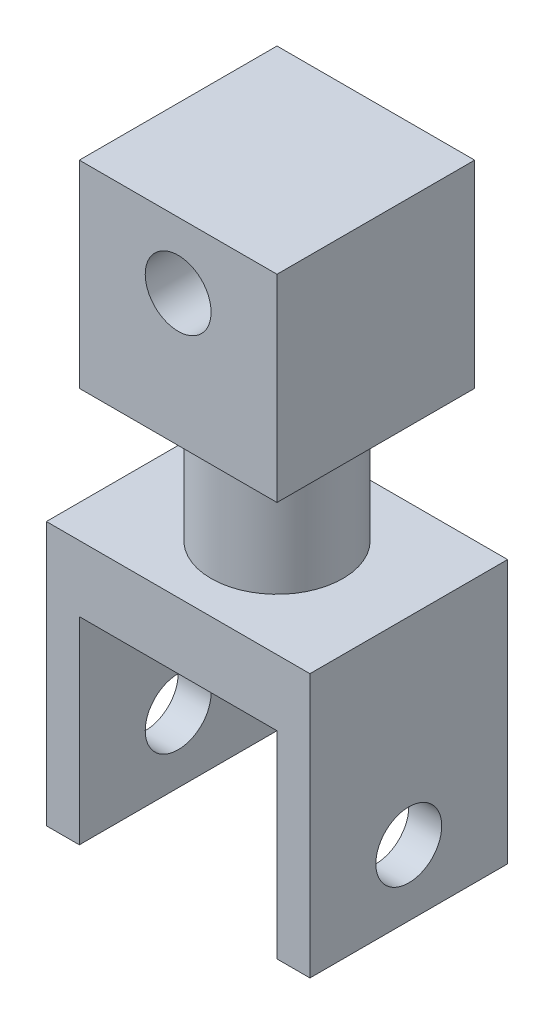
ISO-10303-21;
HEADER;
FILE_DESCRIPTION(('STEP AP214'),'2;1');
FILE_NAME('part.step','',(''),(''),'','','');
FILE_SCHEMA(('AUTOMOTIVE_DESIGN { 1 0 10303 214 1 1 1 1 }'));
ENDSEC;
DATA;
#1=APPLICATION_CONTEXT('core data for automotive mechanical design processes');
#2=APPLICATION_PROTOCOL_DEFINITION('international standard','automotive_design',2000,#1);
#3=PRODUCT_CONTEXT('',#1,'mechanical');
#4=PRODUCT('Part','Part','',(#3));
#5=PRODUCT_RELATED_PRODUCT_CATEGORY('part','',(#4));
#6=PRODUCT_DEFINITION_FORMATION('','',#4);
#7=PRODUCT_DEFINITION_CONTEXT('part definition',#1,'design');
#8=PRODUCT_DEFINITION('design','',#6,#7);
#9=PRODUCT_DEFINITION_SHAPE('','',#8);
#10=(LENGTH_UNIT() NAMED_UNIT(*) SI_UNIT(.MILLI.,.METRE.));
#11=(NAMED_UNIT(*) PLANE_ANGLE_UNIT() SI_UNIT($,.RADIAN.));
#12=(NAMED_UNIT(*) SI_UNIT($,.STERADIAN.) SOLID_ANGLE_UNIT());
#13=UNCERTAINTY_MEASURE_WITH_UNIT(LENGTH_MEASURE(1.E-05),#10,'distance_accuracy_value','');
#14=(GEOMETRIC_REPRESENTATION_CONTEXT(3) GLOBAL_UNCERTAINTY_ASSIGNED_CONTEXT((#13)) GLOBAL_UNIT_ASSIGNED_CONTEXT((#10,
#11,#12)) REPRESENTATION_CONTEXT('',''));
#15=CARTESIAN_POINT('',(0.,0.,0.));
#16=DIRECTION('',(0.,0.,1.));
#17=DIRECTION('',(1.,0.,0.));
#18=AXIS2_PLACEMENT_3D('',#15,#16,#17);
#19=CARTESIAN_POINT('',(0.,0.,0.));
#20=DIRECTION('',(0.,1.,0.));
#21=DIRECTION('',(0.,0.,1.));
#22=AXIS2_PLACEMENT_3D('',#19,#20,#21);
#23=PLANE('',#22);
#24=DIRECTION('',(1.,0.,0.));
#25=VECTOR('',#24,1.);
#26=CARTESIAN_POINT('',(0.,0.,-76.2));
#27=LINE('',#26,#25);
#28=CARTESIAN_POINT('',(0.,0.,-76.2));
#29=VERTEX_POINT('',#28);
#30=CARTESIAN_POINT('',(12.7,0.,-76.2));
#31=VERTEX_POINT('',#30);
#32=EDGE_CURVE('E209',#29,#31,#27,.T.);
#33=ORIENTED_EDGE('',*,*,#32,.T.);
#34=DIRECTION('',(0.,0.,-1.));
#35=VECTOR('',#34,1.);
#36=CARTESIAN_POINT('',(12.7,0.,0.));
#37=LINE('',#36,#35);
#38=CARTESIAN_POINT('',(12.7,0.,0.));
#39=VERTEX_POINT('',#38);
#40=EDGE_CURVE('E163',#39,#31,#37,.T.);
#41=ORIENTED_EDGE('',*,*,#40,.F.);
#42=DIRECTION('',(1.,0.,0.));
#43=VECTOR('',#42,1.);
#44=CARTESIAN_POINT('',(0.,0.,0.));
#45=LINE('',#44,#43);
#46=CARTESIAN_POINT('',(0.,0.,0.));
#47=VERTEX_POINT('',#46);
#48=EDGE_CURVE('E203',#47,#39,#45,.T.);
#49=ORIENTED_EDGE('',*,*,#48,.F.);
#50=DIRECTION('',(0.,0.,-1.));
#51=VECTOR('',#50,1.);
#52=CARTESIAN_POINT('',(0.,0.,0.));
#53=LINE('',#52,#51);
#54=EDGE_CURVE('E196',#47,#29,#53,.T.);
#55=ORIENTED_EDGE('',*,*,#54,.T.);
#56=EDGE_LOOP('',(#33,#41,#49,#55));
#57=FACE_BOUND('',#56,.T.);
#58=ADVANCED_FACE('F35',(#57),#23,.F.);
#59=CARTESIAN_POINT('',(0.,101.6,0.));
#60=DIRECTION('',(0.,0.,-1.));
#61=DIRECTION('',(-1.,0.,0.));
#62=AXIS2_PLACEMENT_3D('',#59,#60,#61);
#63=PLANE('',#62);
#64=ORIENTED_EDGE('',*,*,#48,.T.);
#65=DIRECTION('',(0.,-1.,0.));
#66=VECTOR('',#65,1.);
#67=CARTESIAN_POINT('',(12.7,76.2,0.));
#68=LINE('',#67,#66);
#69=CARTESIAN_POINT('',(12.7,76.2,0.));
#70=VERTEX_POINT('',#69);
#71=EDGE_CURVE('E185',#70,#39,#68,.T.);
#72=ORIENTED_EDGE('',*,*,#71,.F.);
#73=DIRECTION('',(-1.,0.,0.));
#74=VECTOR('',#73,1.);
#75=CARTESIAN_POINT('',(88.9,76.2,0.));
#76=LINE('',#75,#74);
#77=CARTESIAN_POINT('',(88.9,76.2,0.));
#78=VERTEX_POINT('',#77);
#79=EDGE_CURVE('E179',#78,#70,#76,.T.);
#80=ORIENTED_EDGE('',*,*,#79,.F.);
#81=DIRECTION('',(0.,-1.,0.));
#82=VECTOR('',#81,1.);
#83=CARTESIAN_POINT('',(88.9,76.2,0.));
#84=LINE('',#83,#82);
#85=CARTESIAN_POINT('',(88.9,0.,0.));
#86=VERTEX_POINT('',#85);
#87=EDGE_CURVE('E188',#78,#86,#84,.T.);
#88=ORIENTED_EDGE('',*,*,#87,.T.);
#89=CARTESIAN_POINT('',(101.6,0.,0.));
#90=VERTEX_POINT('',#89);
#91=EDGE_CURVE('E187',#86,#90,#45,.T.);
#92=ORIENTED_EDGE('',*,*,#91,.T.);
#93=DIRECTION('',(0.,-1.,0.));
#94=VECTOR('',#93,1.);
#95=CARTESIAN_POINT('',(101.6,101.6,0.));
#96=LINE('',#95,#94);
#97=CARTESIAN_POINT('',(101.6,101.6,0.));
#98=VERTEX_POINT('',#97);
#99=EDGE_CURVE('E44',#98,#90,#96,.T.);
#100=ORIENTED_EDGE('',*,*,#99,.F.);
#101=DIRECTION('',(1.,0.,0.));
#102=VECTOR('',#101,1.);
#103=CARTESIAN_POINT('',(0.,101.6,0.));
#104=LINE('',#103,#102);
#105=CARTESIAN_POINT('',(0.,101.6,0.));
#106=VERTEX_POINT('',#105);
#107=EDGE_CURVE('E194',#106,#98,#104,.T.);
#108=ORIENTED_EDGE('',*,*,#107,.F.);
#109=DIRECTION('',(0.,-1.,0.));
#110=VECTOR('',#109,1.);
#111=CARTESIAN_POINT('',(0.,101.6,0.));
#112=LINE('',#111,#110);
#113=EDGE_CURVE('E61',#106,#47,#112,.T.);
#114=ORIENTED_EDGE('',*,*,#113,.T.);
#115=EDGE_LOOP('',(#64,#72,#80,#88,#92,#100,#108,#114));
#116=FACE_BOUND('',#115,.T.);
#117=ADVANCED_FACE('F37',(#116),#63,.F.);
#118=CARTESIAN_POINT('',(101.6,101.6,0.));
#119=DIRECTION('',(-1.,0.,0.));
#120=DIRECTION('',(0.,0.,1.));
#121=AXIS2_PLACEMENT_3D('',#118,#119,#120);
#122=PLANE('',#121);
#123=CARTESIAN_POINT('',(101.6,25.4,-38.1));
#124=DIRECTION('',(1.,0.,0.));
#125=DIRECTION('',(0.,0.,-1.));
#126=AXIS2_PLACEMENT_3D('',#123,#124,#125);
#127=CIRCLE('',#126,12.7);
#128=CARTESIAN_POINT('',(101.6,25.4,-50.8));
#129=VERTEX_POINT('',#128);
#130=EDGE_CURVE('E317',#129,#129,#127,.T.);
#131=ORIENTED_EDGE('',*,*,#130,.F.);
#132=EDGE_LOOP('',(#131));
#133=FACE_BOUND('',#132,.T.);
#134=DIRECTION('',(0.,0.,-1.));
#135=VECTOR('',#134,1.);
#136=CARTESIAN_POINT('',(101.6,0.,0.));
#137=LINE('',#136,#135);
#138=CARTESIAN_POINT('',(101.6,0.,-76.2));
#139=VERTEX_POINT('',#138);
#140=EDGE_CURVE('E205',#90,#139,#137,.T.);
#141=ORIENTED_EDGE('',*,*,#140,.T.);
#142=DIRECTION('',(0.,-1.,0.));
#143=VECTOR('',#142,1.);
#144=CARTESIAN_POINT('',(101.6,101.6,-76.2));
#145=LINE('',#144,#143);
#146=CARTESIAN_POINT('',(101.6,101.6,-76.2));
#147=VERTEX_POINT('',#146);
#148=EDGE_CURVE('E217',#147,#139,#145,.T.);
#149=ORIENTED_EDGE('',*,*,#148,.F.);
#150=DIRECTION('',(0.,0.,-1.));
#151=VECTOR('',#150,1.);
#152=CARTESIAN_POINT('',(101.6,101.6,0.));
#153=LINE('',#152,#151);
#154=EDGE_CURVE('E88',#98,#147,#153,.T.);
#155=ORIENTED_EDGE('',*,*,#154,.F.);
#156=ORIENTED_EDGE('',*,*,#99,.T.);
#157=EDGE_LOOP('',(#141,#149,#155,#156));
#158=FACE_BOUND('',#157,.T.);
#159=ADVANCED_FACE('F220',(#133,#158),#122,.F.);
#160=CARTESIAN_POINT('',(0.,101.6,-76.2));
#161=DIRECTION('',(0.,0.,-1.));
#162=DIRECTION('',(-1.,0.,0.));
#163=AXIS2_PLACEMENT_3D('',#160,#161,#162);
#164=PLANE('',#163);
#165=DIRECTION('',(0.,-1.,0.));
#166=VECTOR('',#165,1.);
#167=CARTESIAN_POINT('',(12.7,76.2,-76.2));
#168=LINE('',#167,#166);
#169=CARTESIAN_POINT('',(12.7,76.2,-76.2));
#170=VERTEX_POINT('',#169);
#171=EDGE_CURVE('E182',#170,#31,#168,.T.);
#172=ORIENTED_EDGE('',*,*,#171,.T.);
#173=ORIENTED_EDGE('',*,*,#32,.F.);
#174=DIRECTION('',(0.,-1.,0.));
#175=VECTOR('',#174,1.);
#176=CARTESIAN_POINT('',(0.,101.6,-76.2));
#177=LINE('',#176,#175);
#178=CARTESIAN_POINT('',(0.,101.6,-76.2));
#179=VERTEX_POINT('',#178);
#180=EDGE_CURVE('E215',#179,#29,#177,.T.);
#181=ORIENTED_EDGE('',*,*,#180,.F.);
#182=DIRECTION('',(1.,0.,0.));
#183=VECTOR('',#182,1.);
#184=CARTESIAN_POINT('',(0.,101.6,-76.2));
#185=LINE('',#184,#183);
#186=EDGE_CURVE('E198',#179,#147,#185,.T.);
#187=ORIENTED_EDGE('',*,*,#186,.T.);
#188=ORIENTED_EDGE('',*,*,#148,.T.);
#189=CARTESIAN_POINT('',(88.9,0.,-76.2));
#190=VERTEX_POINT('',#189);
#191=EDGE_CURVE('E208',#190,#139,#27,.T.);
#192=ORIENTED_EDGE('',*,*,#191,.F.);
#193=DIRECTION('',(0.,-1.,0.));
#194=VECTOR('',#193,1.);
#195=CARTESIAN_POINT('',(88.9,76.2,-76.2));
#196=LINE('',#195,#194);
#197=CARTESIAN_POINT('',(88.9,76.2,-76.2));
#198=VERTEX_POINT('',#197);
#199=EDGE_CURVE('E52',#198,#190,#196,.T.);
#200=ORIENTED_EDGE('',*,*,#199,.F.);
#201=DIRECTION('',(1.,0.,0.));
#202=VECTOR('',#201,1.);
#203=CARTESIAN_POINT('',(88.9,76.2,-76.2));
#204=LINE('',#203,#202);
#205=EDGE_CURVE('E172',#170,#198,#204,.T.);
#206=ORIENTED_EDGE('',*,*,#205,.F.);
#207=EDGE_LOOP('',(#172,#173,#181,#187,#188,#192,#200,#206));
#208=FACE_BOUND('',#207,.T.);
#209=ADVANCED_FACE('F229',(#208),#164,.T.);
#210=CARTESIAN_POINT('',(0.,101.6,0.));
#211=DIRECTION('',(-1.,0.,0.));
#212=DIRECTION('',(0.,0.,1.));
#213=AXIS2_PLACEMENT_3D('',#210,#211,#212);
#214=PLANE('',#213);
#215=CARTESIAN_POINT('',(0.,25.4,-38.1));
#216=DIRECTION('',(1.,0.,0.));
#217=DIRECTION('',(0.,0.,-1.));
#218=AXIS2_PLACEMENT_3D('',#215,#216,#217);
#219=CIRCLE('',#218,12.7);
#220=CARTESIAN_POINT('',(0.,25.4,-50.8));
#221=VERTEX_POINT('',#220);
#222=EDGE_CURVE('E320',#221,#221,#219,.T.);
#223=ORIENTED_EDGE('',*,*,#222,.T.);
#224=EDGE_LOOP('',(#223));
#225=FACE_BOUND('',#224,.T.);
#226=ORIENTED_EDGE('',*,*,#54,.F.);
#227=ORIENTED_EDGE('',*,*,#113,.F.);
#228=DIRECTION('',(0.,0.,-1.));
#229=VECTOR('',#228,1.);
#230=CARTESIAN_POINT('',(0.,101.6,0.));
#231=LINE('',#230,#229);
#232=EDGE_CURVE('E201',#106,#179,#231,.T.);
#233=ORIENTED_EDGE('',*,*,#232,.T.);
#234=ORIENTED_EDGE('',*,*,#180,.T.);
#235=EDGE_LOOP('',(#226,#227,#233,#234));
#236=FACE_BOUND('',#235,.T.);
#237=ADVANCED_FACE('F234',(#225,#236),#214,.T.);
#238=CARTESIAN_POINT('',(0.,101.6,0.));
#239=DIRECTION('',(0.,1.,0.));
#240=DIRECTION('',(0.,0.,1.));
#241=AXIS2_PLACEMENT_3D('',#238,#239,#240);
#242=PLANE('',#241);
#243=CARTESIAN_POINT('',(50.8,101.6,-38.1));
#244=DIRECTION('',(0.,1.,0.));
#245=DIRECTION('',(0.,0.,1.));
#246=AXIS2_PLACEMENT_3D('',#243,#244,#245);
#247=CIRCLE('',#246,25.4);
#248=CARTESIAN_POINT('',(50.8,101.6,-12.7));
#249=VERTEX_POINT('',#248);
#250=EDGE_CURVE('E11',#249,#249,#247,.T.);
#251=ORIENTED_EDGE('',*,*,#250,.F.);
#252=EDGE_LOOP('',(#251));
#253=FACE_BOUND('',#252,.T.);
#254=ORIENTED_EDGE('',*,*,#107,.T.);
#255=ORIENTED_EDGE('',*,*,#154,.T.);
#256=ORIENTED_EDGE('',*,*,#186,.F.);
#257=ORIENTED_EDGE('',*,*,#232,.F.);
#258=EDGE_LOOP('',(#254,#255,#256,#257));
#259=FACE_BOUND('',#258,.T.);
#260=ADVANCED_FACE('F233',(#253,#259),#242,.T.);
#261=ORIENTED_EDGE('',*,*,#91,.F.);
#262=DIRECTION('',(0.,0.,1.));
#263=VECTOR('',#262,1.);
#264=CARTESIAN_POINT('',(88.9,0.,0.));
#265=LINE('',#264,#263);
#266=EDGE_CURVE('E173',#190,#86,#265,.T.);
#267=ORIENTED_EDGE('',*,*,#266,.F.);
#268=ORIENTED_EDGE('',*,*,#191,.T.);
#269=ORIENTED_EDGE('',*,*,#140,.F.);
#270=EDGE_LOOP('',(#261,#267,#268,#269));
#271=FACE_BOUND('',#270,.T.);
#272=ADVANCED_FACE('F226',(#271),#23,.F.);
#273=CARTESIAN_POINT('',(12.7,76.2,0.));
#274=DIRECTION('',(-1.,0.,0.));
#275=DIRECTION('',(0.,0.,1.));
#276=AXIS2_PLACEMENT_3D('',#273,#274,#275);
#277=PLANE('',#276);
#278=CARTESIAN_POINT('',(12.7,25.4,-38.1));
#279=DIRECTION('',(-1.,0.,0.));
#280=DIRECTION('',(0.,0.,1.));
#281=AXIS2_PLACEMENT_3D('',#278,#279,#280);
#282=CIRCLE('',#281,12.7);
#283=CARTESIAN_POINT('',(12.7,25.4,-25.4));
#284=VERTEX_POINT('',#283);
#285=EDGE_CURVE('E326',#284,#284,#282,.T.);
#286=ORIENTED_EDGE('',*,*,#285,.T.);
#287=EDGE_LOOP('',(#286));
#288=FACE_BOUND('',#287,.T.);
#289=ORIENTED_EDGE('',*,*,#40,.T.);
#290=ORIENTED_EDGE('',*,*,#171,.F.);
#291=DIRECTION('',(0.,0.,-1.));
#292=VECTOR('',#291,1.);
#293=CARTESIAN_POINT('',(12.7,76.2,0.));
#294=LINE('',#293,#292);
#295=EDGE_CURVE('E169',#70,#170,#294,.T.);
#296=ORIENTED_EDGE('',*,*,#295,.F.);
#297=ORIENTED_EDGE('',*,*,#71,.T.);
#298=EDGE_LOOP('',(#289,#290,#296,#297));
#299=FACE_BOUND('',#298,.T.);
#300=ADVANCED_FACE('F240',(#288,#299),#277,.F.);
#301=CARTESIAN_POINT('',(88.9,76.2,0.));
#302=DIRECTION('',(1.,0.,0.));
#303=DIRECTION('',(0.,0.,-1.));
#304=AXIS2_PLACEMENT_3D('',#301,#302,#303);
#305=PLANE('',#304);
#306=CARTESIAN_POINT('',(88.9,25.4,-38.1));
#307=DIRECTION('',(1.,0.,0.));
#308=DIRECTION('',(0.,0.,-1.));
#309=AXIS2_PLACEMENT_3D('',#306,#307,#308);
#310=CIRCLE('',#309,12.7);
#311=CARTESIAN_POINT('',(88.9,25.4,-50.8));
#312=VERTEX_POINT('',#311);
#313=EDGE_CURVE('E39',#312,#312,#310,.T.);
#314=ORIENTED_EDGE('',*,*,#313,.T.);
#315=EDGE_LOOP('',(#314));
#316=FACE_BOUND('',#315,.T.);
#317=ORIENTED_EDGE('',*,*,#266,.T.);
#318=ORIENTED_EDGE('',*,*,#87,.F.);
#319=DIRECTION('',(0.,0.,1.));
#320=VECTOR('',#319,1.);
#321=CARTESIAN_POINT('',(88.9,76.2,0.));
#322=LINE('',#321,#320);
#323=EDGE_CURVE('E176',#198,#78,#322,.T.);
#324=ORIENTED_EDGE('',*,*,#323,.F.);
#325=ORIENTED_EDGE('',*,*,#199,.T.);
#326=EDGE_LOOP('',(#317,#318,#324,#325));
#327=FACE_BOUND('',#326,.T.);
#328=ADVANCED_FACE('F243',(#316,#327),#305,.F.);
#329=CARTESIAN_POINT('',(0.,76.2,0.));
#330=DIRECTION('',(0.,1.,0.));
#331=DIRECTION('',(0.,0.,1.));
#332=AXIS2_PLACEMENT_3D('',#329,#330,#331);
#333=PLANE('',#332);
#334=ORIENTED_EDGE('',*,*,#295,.T.);
#335=ORIENTED_EDGE('',*,*,#205,.T.);
#336=ORIENTED_EDGE('',*,*,#323,.T.);
#337=ORIENTED_EDGE('',*,*,#79,.T.);
#338=EDGE_LOOP('',(#334,#335,#336,#337));
#339=FACE_BOUND('',#338,.T.);
#340=ADVANCED_FACE('F242',(#339),#333,.F.);
#341=CARTESIAN_POINT('',(50.8,152.4,-38.1));
#342=DIRECTION('',(0.,-1.,0.));
#343=DIRECTION('',(0.,0.,-1.));
#344=AXIS2_PLACEMENT_3D('',#341,#342,#343);
#345=CYLINDRICAL_SURFACE('',#344,25.4);
#346=CARTESIAN_POINT('',(50.8,152.4,-38.1));
#347=DIRECTION('',(0.,1.,0.));
#348=DIRECTION('',(0.,0.,1.));
#349=AXIS2_PLACEMENT_3D('',#346,#347,#348);
#350=CIRCLE('',#349,25.4);
#351=CARTESIAN_POINT('',(50.8,152.4,-12.7));
#352=VERTEX_POINT('',#351);
#353=EDGE_CURVE('E160',#352,#352,#350,.T.);
#354=ORIENTED_EDGE('',*,*,#353,.F.);
#355=EDGE_LOOP('',(#354));
#356=FACE_BOUND('',#355,.T.);
#357=ORIENTED_EDGE('',*,*,#250,.T.);
#358=EDGE_LOOP('',(#357));
#359=FACE_BOUND('',#358,.T.);
#360=ADVANCED_FACE('F251',(#356,#359),#345,.T.);
#361=CARTESIAN_POINT('',(12.7,228.6,-76.2));
#362=DIRECTION('',(1.,0.,0.));
#363=DIRECTION('',(0.,0.,-1.));
#364=AXIS2_PLACEMENT_3D('',#361,#362,#363);
#365=PLANE('',#364);
#366=DIRECTION('',(0.,0.,1.));
#367=VECTOR('',#366,1.);
#368=CARTESIAN_POINT('',(12.7,152.4,-76.2));
#369=LINE('',#368,#367);
#370=CARTESIAN_POINT('',(12.7,152.4,-76.2));
#371=VERTEX_POINT('',#370);
#372=CARTESIAN_POINT('',(12.7,152.4,0.));
#373=VERTEX_POINT('',#372);
#374=EDGE_CURVE('E159',#371,#373,#369,.T.);
#375=ORIENTED_EDGE('',*,*,#374,.T.);
#376=DIRECTION('',(0.,-1.,0.));
#377=VECTOR('',#376,1.);
#378=CARTESIAN_POINT('',(12.7,228.6,0.));
#379=LINE('',#378,#377);
#380=CARTESIAN_POINT('',(12.7,228.6,0.));
#381=VERTEX_POINT('',#380);
#382=EDGE_CURVE('E139',#381,#373,#379,.T.);
#383=ORIENTED_EDGE('',*,*,#382,.F.);
#384=DIRECTION('',(0.,0.,1.));
#385=VECTOR('',#384,1.);
#386=CARTESIAN_POINT('',(12.7,228.6,-76.2));
#387=LINE('',#386,#385);
#388=CARTESIAN_POINT('',(12.7,228.6,-76.2));
#389=VERTEX_POINT('',#388);
#390=EDGE_CURVE('E146',#389,#381,#387,.T.);
#391=ORIENTED_EDGE('',*,*,#390,.F.);
#392=DIRECTION('',(0.,-1.,0.));
#393=VECTOR('',#392,1.);
#394=CARTESIAN_POINT('',(12.7,228.6,-76.2));
#395=LINE('',#394,#393);
#396=EDGE_CURVE('E331',#389,#371,#395,.T.);
#397=ORIENTED_EDGE('',*,*,#396,.T.);
#398=EDGE_LOOP('',(#375,#383,#391,#397));
#399=FACE_BOUND('',#398,.T.);
#400=ADVANCED_FACE('F157',(#399),#365,.F.);
#401=CARTESIAN_POINT('',(88.9,228.6,0.));
#402=DIRECTION('',(0.,0.,-1.));
#403=DIRECTION('',(-1.,0.,0.));
#404=AXIS2_PLACEMENT_3D('',#401,#402,#403);
#405=PLANE('',#404);
#406=CARTESIAN_POINT('',(50.8,203.2,0.));
#407=DIRECTION('',(0.,0.,-1.));
#408=DIRECTION('',(-1.,0.,0.));
#409=AXIS2_PLACEMENT_3D('',#406,#407,#408);
#410=CIRCLE('',#409,12.7);
#411=CARTESIAN_POINT('',(38.1000000000001,203.2,0.));
#412=VERTEX_POINT('',#411);
#413=EDGE_CURVE('E316',#412,#412,#410,.F.);
#414=ORIENTED_EDGE('',*,*,#413,.F.);
#415=EDGE_LOOP('',(#414));
#416=FACE_BOUND('',#415,.T.);
#417=DIRECTION('',(1.,0.,0.));
#418=VECTOR('',#417,1.);
#419=CARTESIAN_POINT('',(88.9,152.4,0.));
#420=LINE('',#419,#418);
#421=CARTESIAN_POINT('',(88.9,152.4,0.));
#422=VERTEX_POINT('',#421);
#423=EDGE_CURVE('E333',#373,#422,#420,.T.);
#424=ORIENTED_EDGE('',*,*,#423,.T.);
#425=DIRECTION('',(0.,-1.,0.));
#426=VECTOR('',#425,1.);
#427=CARTESIAN_POINT('',(88.9,228.6,0.));
#428=LINE('',#427,#426);
#429=CARTESIAN_POINT('',(88.9,228.6,0.));
#430=VERTEX_POINT('',#429);
#431=EDGE_CURVE('E142',#430,#422,#428,.T.);
#432=ORIENTED_EDGE('',*,*,#431,.F.);
#433=DIRECTION('',(1.,0.,0.));
#434=VECTOR('',#433,1.);
#435=CARTESIAN_POINT('',(88.9,228.6,0.));
#436=LINE('',#435,#434);
#437=EDGE_CURVE('E135',#381,#430,#436,.T.);
#438=ORIENTED_EDGE('',*,*,#437,.F.);
#439=ORIENTED_EDGE('',*,*,#382,.T.);
#440=EDGE_LOOP('',(#424,#432,#438,#439));
#441=FACE_BOUND('',#440,.T.);
#442=ADVANCED_FACE('F137',(#416,#441),#405,.F.);
#443=CARTESIAN_POINT('',(88.9,228.6,-76.2));
#444=DIRECTION('',(-1.,0.,0.));
#445=DIRECTION('',(0.,0.,1.));
#446=AXIS2_PLACEMENT_3D('',#443,#444,#445);
#447=PLANE('',#446);
#448=DIRECTION('',(0.,0.,-1.));
#449=VECTOR('',#448,1.);
#450=CARTESIAN_POINT('',(88.9,152.4,-76.2));
#451=LINE('',#450,#449);
#452=CARTESIAN_POINT('',(88.9,152.4,-76.2));
#453=VERTEX_POINT('',#452);
#454=EDGE_CURVE('E335',#422,#453,#451,.T.);
#455=ORIENTED_EDGE('',*,*,#454,.T.);
#456=DIRECTION('',(0.,-1.,0.));
#457=VECTOR('',#456,1.);
#458=CARTESIAN_POINT('',(88.9,228.6,-76.2));
#459=LINE('',#458,#457);
#460=CARTESIAN_POINT('',(88.9,228.6,-76.2));
#461=VERTEX_POINT('',#460);
#462=EDGE_CURVE('E165',#461,#453,#459,.T.);
#463=ORIENTED_EDGE('',*,*,#462,.F.);
#464=DIRECTION('',(0.,0.,-1.));
#465=VECTOR('',#464,1.);
#466=CARTESIAN_POINT('',(88.9,228.6,-76.2));
#467=LINE('',#466,#465);
#468=EDGE_CURVE('E145',#430,#461,#467,.T.);
#469=ORIENTED_EDGE('',*,*,#468,.F.);
#470=ORIENTED_EDGE('',*,*,#431,.T.);
#471=EDGE_LOOP('',(#455,#463,#469,#470));
#472=FACE_BOUND('',#471,.T.);
#473=ADVANCED_FACE('F285',(#472),#447,.F.);
#474=CARTESIAN_POINT('',(88.9,228.6,-76.2));
#475=DIRECTION('',(0.,0.,1.));
#476=DIRECTION('',(1.,0.,0.));
#477=AXIS2_PLACEMENT_3D('',#474,#475,#476);
#478=PLANE('',#477);
#479=CARTESIAN_POINT('',(50.8,203.2,-76.2));
#480=DIRECTION('',(0.,0.,-1.));
#481=DIRECTION('',(-1.,0.,0.));
#482=AXIS2_PLACEMENT_3D('',#479,#480,#481);
#483=CIRCLE('',#482,12.7);
#484=CARTESIAN_POINT('',(38.1,203.2,-76.2));
#485=VERTEX_POINT('',#484);
#486=EDGE_CURVE('E313',#485,#485,#483,.T.);
#487=ORIENTED_EDGE('',*,*,#486,.F.);
#488=EDGE_LOOP('',(#487));
#489=FACE_BOUND('',#488,.T.);
#490=DIRECTION('',(-1.,0.,0.));
#491=VECTOR('',#490,1.);
#492=CARTESIAN_POINT('',(88.9,152.4,-76.2));
#493=LINE('',#492,#491);
#494=EDGE_CURVE('E155',#453,#371,#493,.T.);
#495=ORIENTED_EDGE('',*,*,#494,.T.);
#496=ORIENTED_EDGE('',*,*,#396,.F.);
#497=DIRECTION('',(-1.,0.,0.));
#498=VECTOR('',#497,1.);
#499=CARTESIAN_POINT('',(88.9,228.6,-76.2));
#500=LINE('',#499,#498);
#501=EDGE_CURVE('E151',#461,#389,#500,.T.);
#502=ORIENTED_EDGE('',*,*,#501,.F.);
#503=ORIENTED_EDGE('',*,*,#462,.T.);
#504=EDGE_LOOP('',(#495,#496,#502,#503));
#505=FACE_BOUND('',#504,.T.);
#506=ADVANCED_FACE('F289',(#489,#505),#478,.F.);
#507=CARTESIAN_POINT('',(0.,228.6,0.));
#508=DIRECTION('',(0.,-1.,0.));
#509=DIRECTION('',(0.,0.,-1.));
#510=AXIS2_PLACEMENT_3D('',#507,#508,#509);
#511=PLANE('',#510);
#512=ORIENTED_EDGE('',*,*,#390,.T.);
#513=ORIENTED_EDGE('',*,*,#437,.T.);
#514=ORIENTED_EDGE('',*,*,#468,.T.);
#515=ORIENTED_EDGE('',*,*,#501,.T.);
#516=EDGE_LOOP('',(#512,#513,#514,#515));
#517=FACE_BOUND('',#516,.T.);
#518=ADVANCED_FACE('F149',(#517),#511,.F.);
#519=CARTESIAN_POINT('',(0.,152.4,0.));
#520=DIRECTION('',(0.,-1.,0.));
#521=DIRECTION('',(0.,0.,-1.));
#522=AXIS2_PLACEMENT_3D('',#519,#520,#521);
#523=PLANE('',#522);
#524=ORIENTED_EDGE('',*,*,#353,.T.);
#525=EDGE_LOOP('',(#524));
#526=FACE_BOUND('',#525,.T.);
#527=ORIENTED_EDGE('',*,*,#374,.F.);
#528=ORIENTED_EDGE('',*,*,#494,.F.);
#529=ORIENTED_EDGE('',*,*,#454,.F.);
#530=ORIENTED_EDGE('',*,*,#423,.F.);
#531=EDGE_LOOP('',(#527,#528,#529,#530));
#532=FACE_BOUND('',#531,.T.);
#533=ADVANCED_FACE('F294',(#526,#532),#523,.T.);
#534=CARTESIAN_POINT('',(0.,25.4,-38.1));
#535=DIRECTION('',(1.,0.,0.));
#536=DIRECTION('',(0.,0.,-1.));
#537=AXIS2_PLACEMENT_3D('',#534,#535,#536);
#538=CYLINDRICAL_SURFACE('',#537,12.7);
#539=ORIENTED_EDGE('',*,*,#130,.T.);
#540=EDGE_LOOP('',(#539));
#541=FACE_BOUND('',#540,.T.);
#542=ORIENTED_EDGE('',*,*,#313,.F.);
#543=EDGE_LOOP('',(#542));
#544=FACE_BOUND('',#543,.T.);
#545=ADVANCED_FACE('F297',(#541,#544),#538,.F.);
#546=ORIENTED_EDGE('',*,*,#222,.F.);
#547=EDGE_LOOP('',(#546));
#548=FACE_BOUND('',#547,.T.);
#549=ORIENTED_EDGE('',*,*,#285,.F.);
#550=EDGE_LOOP('',(#549));
#551=FACE_BOUND('',#550,.T.);
#552=ADVANCED_FACE('F301',(#548,#551),#538,.F.);
#553=CARTESIAN_POINT('',(50.8,203.2,0.00100000000005651));
#554=DIRECTION('',(0.,0.,-1.));
#555=DIRECTION('',(-1.,0.,0.));
#556=AXIS2_PLACEMENT_3D('',#553,#554,#555);
#557=CYLINDRICAL_SURFACE('',#556,12.7);
#558=ORIENTED_EDGE('',*,*,#486,.T.);
#559=EDGE_LOOP('',(#558));
#560=FACE_BOUND('',#559,.T.);
#561=ORIENTED_EDGE('',*,*,#413,.T.);
#562=EDGE_LOOP('',(#561));
#563=FACE_BOUND('',#562,.T.);
#564=ADVANCED_FACE('F304',(#560,#563),#557,.F.);
#565=CLOSED_SHELL('',(#58,#117,#159,#209,#237,#260,#272,#300,#328,#340,#360,#400,#442,#473,#506,
#518,#533,#545,#552,#564));
#566=MANIFOLD_SOLID_BREP('B2',#565);
#567=ADVANCED_BREP_SHAPE_REPRESENTATION('',(#18,#566),#14);
#568=SHAPE_DEFINITION_REPRESENTATION(#9,#567);
ENDSEC;
END-ISO-10303-21;
